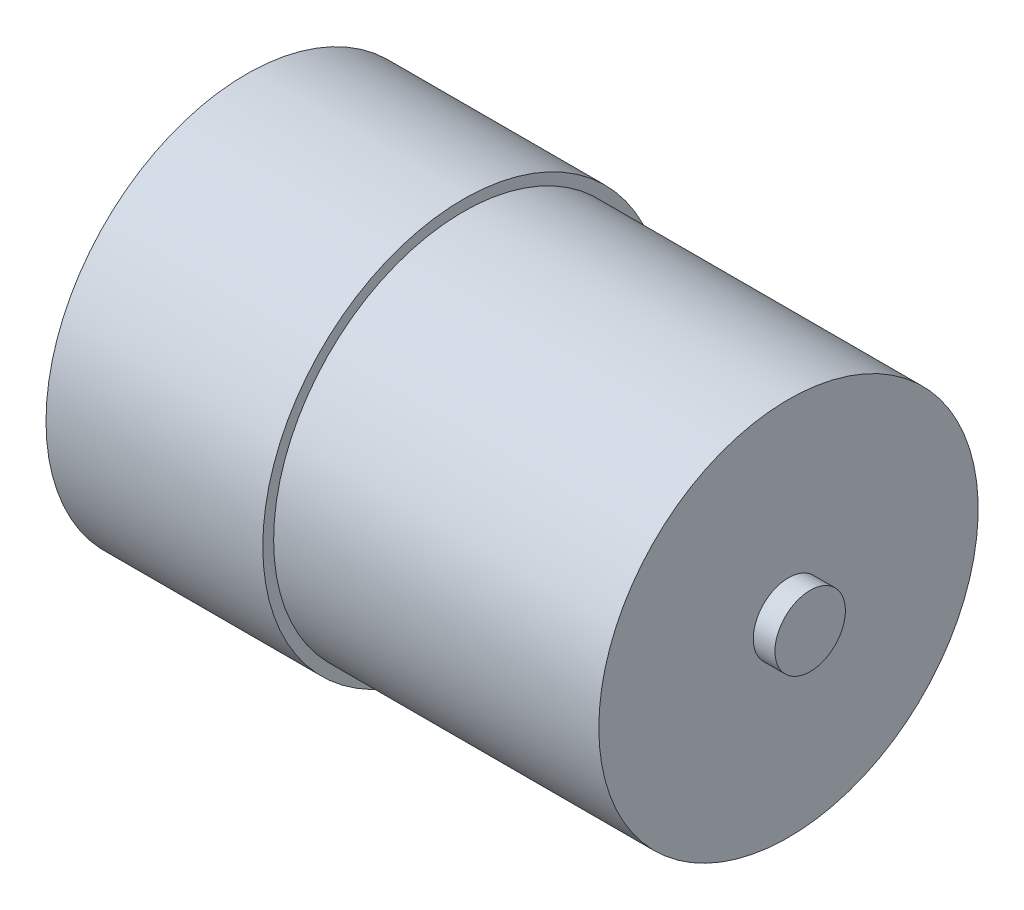
ISO-10303-21;
HEADER;
FILE_DESCRIPTION(('STEP AP214'),'2;1');
FILE_NAME('part.step','',(''),(''),'','','');
FILE_SCHEMA(('AUTOMOTIVE_DESIGN { 1 0 10303 214 1 1 1 1 }'));
ENDSEC;
DATA;
#1=APPLICATION_CONTEXT('core data for automotive mechanical design processes');
#2=APPLICATION_PROTOCOL_DEFINITION('international standard','automotive_design',2000,#1);
#3=PRODUCT_CONTEXT('',#1,'mechanical');
#4=PRODUCT('Part','Part','',(#3));
#5=PRODUCT_RELATED_PRODUCT_CATEGORY('part','',(#4));
#6=PRODUCT_DEFINITION_FORMATION('','',#4);
#7=PRODUCT_DEFINITION_CONTEXT('part definition',#1,'design');
#8=PRODUCT_DEFINITION('design','',#6,#7);
#9=PRODUCT_DEFINITION_SHAPE('','',#8);
#10=(LENGTH_UNIT() NAMED_UNIT(*) SI_UNIT(.MILLI.,.METRE.));
#11=(NAMED_UNIT(*) PLANE_ANGLE_UNIT() SI_UNIT($,.RADIAN.));
#12=(NAMED_UNIT(*) SI_UNIT($,.STERADIAN.) SOLID_ANGLE_UNIT());
#13=UNCERTAINTY_MEASURE_WITH_UNIT(LENGTH_MEASURE(1.E-05),#10,'distance_accuracy_value','');
#14=(GEOMETRIC_REPRESENTATION_CONTEXT(3) GLOBAL_UNCERTAINTY_ASSIGNED_CONTEXT((#13)) GLOBAL_UNIT_ASSIGNED_CONTEXT((#10,
#11,#12)) REPRESENTATION_CONTEXT('',''));
#15=CARTESIAN_POINT('',(0.,0.,0.));
#16=DIRECTION('',(0.,0.,1.));
#17=DIRECTION('',(1.,0.,0.));
#18=AXIS2_PLACEMENT_3D('',#15,#16,#17);
#19=CARTESIAN_POINT('',(30.,0.,0.));
#20=DIRECTION('',(1.,0.,0.));
#21=DIRECTION('',(0.,0.,-1.));
#22=AXIS2_PLACEMENT_3D('',#19,#20,#21);
#23=PLANE('',#22);
#24=CARTESIAN_POINT('',(30.,0.,0.));
#25=DIRECTION('',(-1.,0.,0.));
#26=DIRECTION('',(0.,0.,1.));
#27=AXIS2_PLACEMENT_3D('',#24,#25,#26);
#28=CIRCLE('',#27,3.25);
#29=CARTESIAN_POINT('',(30.,0.,3.25));
#30=VERTEX_POINT('',#29);
#31=EDGE_CURVE('E87',#30,#30,#28,.T.);
#32=ORIENTED_EDGE('',*,*,#31,.T.);
#33=EDGE_LOOP('',(#32));
#34=FACE_BOUND('',#33,.T.);
#35=CARTESIAN_POINT('',(30.,0.,0.));
#36=DIRECTION('',(-1.,0.,0.));
#37=DIRECTION('',(0.,0.,1.));
#38=AXIS2_PLACEMENT_3D('',#35,#36,#37);
#39=CIRCLE('',#38,17.5);
#40=CARTESIAN_POINT('',(30.,0.,17.5));
#41=VERTEX_POINT('',#40);
#42=EDGE_CURVE('E72',#41,#41,#39,.T.);
#43=ORIENTED_EDGE('',*,*,#42,.F.);
#44=EDGE_LOOP('',(#43));
#45=FACE_BOUND('',#44,.T.);
#46=ADVANCED_FACE('F43',(#34,#45),#23,.T.);
#47=CARTESIAN_POINT('',(-72.0349695755369,0.,0.));
#48=DIRECTION('',(-1.,0.,0.));
#49=DIRECTION('',(0.,0.,1.));
#50=AXIS2_PLACEMENT_3D('',#47,#48,#49);
#51=CYLINDRICAL_SURFACE('',#50,17.5);
#52=ORIENTED_EDGE('',*,*,#42,.T.);
#53=EDGE_LOOP('',(#52));
#54=FACE_BOUND('',#53,.T.);
#55=CARTESIAN_POINT('',(0.,0.,0.));
#56=DIRECTION('',(-1.,0.,0.));
#57=DIRECTION('',(0.,0.,1.));
#58=AXIS2_PLACEMENT_3D('',#55,#56,#57);
#59=CIRCLE('',#58,17.5);
#60=CARTESIAN_POINT('',(0.,0.,17.5));
#61=VERTEX_POINT('',#60);
#62=EDGE_CURVE('E105',#61,#61,#59,.T.);
#63=ORIENTED_EDGE('',*,*,#62,.F.);
#64=EDGE_LOOP('',(#63));
#65=FACE_BOUND('',#64,.T.);
#66=ADVANCED_FACE('F111',(#54,#65),#51,.T.);
#67=CARTESIAN_POINT('',(0.,0.,0.));
#68=DIRECTION('',(1.,0.,0.));
#69=DIRECTION('',(0.,0.,-1.));
#70=AXIS2_PLACEMENT_3D('',#67,#68,#69);
#71=PLANE('',#70);
#72=ORIENTED_EDGE('',*,*,#62,.T.);
#73=EDGE_LOOP('',(#72));
#74=FACE_BOUND('',#73,.T.);
#75=CARTESIAN_POINT('',(0.,0.,0.));
#76=DIRECTION('',(-1.,0.,0.));
#77=DIRECTION('',(0.,0.,1.));
#78=AXIS2_PLACEMENT_3D('',#75,#76,#77);
#79=CIRCLE('',#78,18.5);
#80=CARTESIAN_POINT('',(0.,0.,18.5));
#81=VERTEX_POINT('',#80);
#82=EDGE_CURVE('E102',#81,#81,#79,.T.);
#83=ORIENTED_EDGE('',*,*,#82,.F.);
#84=EDGE_LOOP('',(#83));
#85=FACE_BOUND('',#84,.T.);
#86=ADVANCED_FACE('F119',(#74,#85),#71,.T.);
#87=CARTESIAN_POINT('',(-72.0349695755369,0.,0.));
#88=DIRECTION('',(-1.,0.,0.));
#89=DIRECTION('',(0.,0.,1.));
#90=AXIS2_PLACEMENT_3D('',#87,#88,#89);
#91=CYLINDRICAL_SURFACE('',#90,18.5);
#92=ORIENTED_EDGE('',*,*,#82,.T.);
#93=EDGE_LOOP('',(#92));
#94=FACE_BOUND('',#93,.T.);
#95=CARTESIAN_POINT('',(-20.,0.,0.));
#96=DIRECTION('',(-1.,0.,0.));
#97=DIRECTION('',(0.,0.,1.));
#98=AXIS2_PLACEMENT_3D('',#95,#96,#97);
#99=CIRCLE('',#98,18.5);
#100=CARTESIAN_POINT('',(-20.,0.,18.5));
#101=VERTEX_POINT('',#100);
#102=EDGE_CURVE('E99',#101,#101,#99,.T.);
#103=ORIENTED_EDGE('',*,*,#102,.F.);
#104=EDGE_LOOP('',(#103));
#105=FACE_BOUND('',#104,.T.);
#106=ADVANCED_FACE('F244',(#94,#105),#91,.T.);
#107=CARTESIAN_POINT('',(-20.,0.,0.));
#108=DIRECTION('',(-1.,0.,0.));
#109=DIRECTION('',(0.,0.,1.));
#110=AXIS2_PLACEMENT_3D('',#107,#108,#109);
#111=PLANE('',#110);
#112=CARTESIAN_POINT('',(-20.,0.,15.5));
#113=DIRECTION('',(-1.,0.,0.));
#114=DIRECTION('',(0.,0.,1.));
#115=AXIS2_PLACEMENT_3D('',#112,#113,#114);
#116=CIRCLE('',#115,1.5);
#117=CARTESIAN_POINT('',(-20.,0.,17.));
#118=VERTEX_POINT('',#117);
#119=EDGE_CURVE('E125',#118,#118,#116,.T.);
#120=ORIENTED_EDGE('',*,*,#119,.F.);
#121=EDGE_LOOP('',(#120));
#122=FACE_BOUND('',#121,.T.);
#123=CARTESIAN_POINT('',(-20.,13.4233937586587,7.75000000000016));
#124=DIRECTION('',(-1.,0.,0.));
#125=DIRECTION('',(0.,0.,1.));
#126=AXIS2_PLACEMENT_3D('',#123,#124,#125);
#127=CIRCLE('',#126,1.5);
#128=CARTESIAN_POINT('',(-20.,13.4233937586587,9.25000000000016));
#129=VERTEX_POINT('',#128);
#130=EDGE_CURVE('E77',#129,#129,#127,.T.);
#131=ORIENTED_EDGE('',*,*,#130,.F.);
#132=EDGE_LOOP('',(#131));
#133=FACE_BOUND('',#132,.T.);
#134=CARTESIAN_POINT('',(-20.,13.4233937586589,-7.74999999999987));
#135=DIRECTION('',(-1.,0.,0.));
#136=DIRECTION('',(0.,0.,1.));
#137=AXIS2_PLACEMENT_3D('',#134,#135,#136);
#138=CIRCLE('',#137,1.5);
#139=CARTESIAN_POINT('',(-20.,13.4233937586589,-6.24999999999987));
#140=VERTEX_POINT('',#139);
#141=EDGE_CURVE('E128',#140,#140,#138,.T.);
#142=ORIENTED_EDGE('',*,*,#141,.F.);
#143=EDGE_LOOP('',(#142));
#144=FACE_BOUND('',#143,.T.);
#145=CARTESIAN_POINT('',(-20.,1.08235921504137E-13,-15.5));
#146=DIRECTION('',(-1.,0.,0.));
#147=DIRECTION('',(0.,0.,1.));
#148=AXIS2_PLACEMENT_3D('',#145,#146,#147);
#149=CIRCLE('',#148,1.5);
#150=CARTESIAN_POINT('',(-20.,1.08235921504137E-13,-14.));
#151=VERTEX_POINT('',#150);
#152=EDGE_CURVE('E135',#151,#151,#149,.T.);
#153=ORIENTED_EDGE('',*,*,#152,.F.);
#154=EDGE_LOOP('',(#153));
#155=FACE_BOUND('',#154,.T.);
#156=CARTESIAN_POINT('',(-20.,-13.4233937586588,-7.75000000000006));
#157=DIRECTION('',(-1.,0.,0.));
#158=DIRECTION('',(0.,0.,1.));
#159=AXIS2_PLACEMENT_3D('',#156,#157,#158);
#160=CIRCLE('',#159,1.5);
#161=CARTESIAN_POINT('',(-20.,-13.4233937586588,-6.25000000000006));
#162=VERTEX_POINT('',#161);
#163=EDGE_CURVE('E141',#162,#162,#160,.T.);
#164=ORIENTED_EDGE('',*,*,#163,.F.);
#165=EDGE_LOOP('',(#164));
#166=FACE_BOUND('',#165,.T.);
#167=CARTESIAN_POINT('',(-20.,-13.4233937586588,7.74999999999997));
#168=DIRECTION('',(-1.,0.,0.));
#169=DIRECTION('',(0.,0.,1.));
#170=AXIS2_PLACEMENT_3D('',#167,#168,#169);
#171=CIRCLE('',#170,1.5);
#172=CARTESIAN_POINT('',(-20.,-13.4233937586588,9.24999999999997));
#173=VERTEX_POINT('',#172);
#174=EDGE_CURVE('E147',#173,#173,#171,.T.);
#175=ORIENTED_EDGE('',*,*,#174,.F.);
#176=EDGE_LOOP('',(#175));
#177=FACE_BOUND('',#176,.T.);
#178=ORIENTED_EDGE('',*,*,#102,.T.);
#179=EDGE_LOOP('',(#178));
#180=FACE_BOUND('',#179,.T.);
#181=CARTESIAN_POINT('',(-20.,0.,0.));
#182=DIRECTION('',(-1.,0.,0.));
#183=DIRECTION('',(0.,0.,1.));
#184=AXIS2_PLACEMENT_3D('',#181,#182,#183);
#185=CIRCLE('',#184,3.5);
#186=CARTESIAN_POINT('',(-20.,0.,3.5));
#187=VERTEX_POINT('',#186);
#188=EDGE_CURVE('E96',#187,#187,#185,.T.);
#189=ORIENTED_EDGE('',*,*,#188,.F.);
#190=EDGE_LOOP('',(#189));
#191=FACE_BOUND('',#190,.T.);
#192=ADVANCED_FACE('F240',(#122,#133,#144,#155,#166,#177,#180,#191),#111,.T.);
#193=CARTESIAN_POINT('',(-72.0349695755369,0.,0.));
#194=DIRECTION('',(-1.,0.,0.));
#195=DIRECTION('',(0.,0.,1.));
#196=AXIS2_PLACEMENT_3D('',#193,#194,#195);
#197=CYLINDRICAL_SURFACE('',#196,3.5);
#198=ORIENTED_EDGE('',*,*,#188,.T.);
#199=EDGE_LOOP('',(#198));
#200=FACE_BOUND('',#199,.T.);
#201=CARTESIAN_POINT('',(-22.5,0.,0.));
#202=DIRECTION('',(-1.,0.,0.));
#203=DIRECTION('',(0.,0.,1.));
#204=AXIS2_PLACEMENT_3D('',#201,#202,#203);
#205=CIRCLE('',#204,3.5);
#206=CARTESIAN_POINT('',(-22.5,0.,3.5));
#207=VERTEX_POINT('',#206);
#208=EDGE_CURVE('E93',#207,#207,#205,.T.);
#209=ORIENTED_EDGE('',*,*,#208,.F.);
#210=EDGE_LOOP('',(#209));
#211=FACE_BOUND('',#210,.T.);
#212=ADVANCED_FACE('F236',(#200,#211),#197,.T.);
#213=CARTESIAN_POINT('',(-22.5,0.,0.));
#214=DIRECTION('',(-1.,0.,0.));
#215=DIRECTION('',(0.,0.,1.));
#216=AXIS2_PLACEMENT_3D('',#213,#214,#215);
#217=PLANE('',#216);
#218=ORIENTED_EDGE('',*,*,#208,.T.);
#219=EDGE_LOOP('',(#218));
#220=FACE_BOUND('',#219,.T.);
#221=CARTESIAN_POINT('',(-22.5,0.,0.));
#222=DIRECTION('',(-1.,0.,0.));
#223=DIRECTION('',(0.,0.,1.));
#224=AXIS2_PLACEMENT_3D('',#221,#222,#223);
#225=CIRCLE('',#224,2.16814596487607);
#226=CARTESIAN_POINT('',(-22.5,0.,2.16814596487607));
#227=VERTEX_POINT('',#226);
#228=EDGE_CURVE('E84',#227,#227,#225,.T.);
#229=ORIENTED_EDGE('',*,*,#228,.F.);
#230=EDGE_LOOP('',(#229));
#231=FACE_BOUND('',#230,.T.);
#232=ADVANCED_FACE('F232',(#220,#231),#217,.T.);
#233=CARTESIAN_POINT('',(-22.4416649153367,0.,0.));
#234=DIRECTION('',(-1.,0.,0.));
#235=DIRECTION('',(0.,0.,1.));
#236=AXIS2_PLACEMENT_3D('',#233,#234,#235);
#237=CONICAL_SURFACE('',#236,2.,1.23685799911754);
#238=ORIENTED_EDGE('',*,*,#228,.T.);
#239=EDGE_LOOP('',(#238));
#240=FACE_BOUND('',#239,.T.);
#241=CARTESIAN_POINT('',(-22.4416649153367,0.,0.));
#242=DIRECTION('',(-1.,0.,0.));
#243=DIRECTION('',(0.,0.,1.));
#244=AXIS2_PLACEMENT_3D('',#241,#242,#243);
#245=CIRCLE('',#244,2.);
#246=CARTESIAN_POINT('',(-22.4416649153367,0.,2.));
#247=VERTEX_POINT('',#246);
#248=EDGE_CURVE('E80',#247,#247,#245,.T.);
#249=ORIENTED_EDGE('',*,*,#248,.F.);
#250=EDGE_LOOP('',(#249));
#251=FACE_BOUND('',#250,.T.);
#252=ADVANCED_FACE('F229',(#240,#251),#237,.F.);
#253=CARTESIAN_POINT('',(-72.0349695755369,0.,0.));
#254=DIRECTION('',(-1.,0.,0.));
#255=DIRECTION('',(0.,0.,1.));
#256=AXIS2_PLACEMENT_3D('',#253,#254,#255);
#257=CYLINDRICAL_SURFACE('',#256,2.);
#258=DIRECTION('',(-1.,0.,0.));
#259=VECTOR('',#258,1.);
#260=CARTESIAN_POINT('',(-72.0349695755369,1.5,1.3228756555323));
#261=LINE('',#260,#259);
#262=CARTESIAN_POINT('',(-31.4416649153367,1.5,1.3228756555323));
#263=VERTEX_POINT('',#262);
#264=CARTESIAN_POINT('',(-23.4416649153367,1.5,1.3228756555323));
#265=VERTEX_POINT('',#264);
#266=EDGE_CURVE('E62',#263,#265,#261,.F.);
#267=ORIENTED_EDGE('',*,*,#266,.F.);
#268=CARTESIAN_POINT('',(-31.4416649153367,0.,0.));
#269=DIRECTION('',(-1.,0.,0.));
#270=DIRECTION('',(0.,0.,1.));
#271=AXIS2_PLACEMENT_3D('',#268,#269,#270);
#272=CIRCLE('',#271,2.);
#273=CARTESIAN_POINT('',(-31.4416649153367,1.5,-1.3228756555323));
#274=VERTEX_POINT('',#273);
#275=EDGE_CURVE('E76',#274,#263,#272,.T.);
#276=ORIENTED_EDGE('',*,*,#275,.F.);
#277=DIRECTION('',(-1.,0.,0.));
#278=VECTOR('',#277,1.);
#279=CARTESIAN_POINT('',(-72.0349695755369,1.5,-1.3228756555323));
#280=LINE('',#279,#278);
#281=CARTESIAN_POINT('',(-23.4416649153367,1.5,-1.3228756555323));
#282=VERTEX_POINT('',#281);
#283=EDGE_CURVE('E57',#282,#274,#280,.T.);
#284=ORIENTED_EDGE('',*,*,#283,.F.);
#285=CARTESIAN_POINT('',(-23.4416649153367,0.,0.));
#286=DIRECTION('',(-1.,0.,0.));
#287=DIRECTION('',(0.,0.,1.));
#288=AXIS2_PLACEMENT_3D('',#285,#286,#287);
#289=CIRCLE('',#288,2.);
#290=EDGE_CURVE('E11',#282,#265,#289,.F.);
#291=ORIENTED_EDGE('',*,*,#290,.T.);
#292=EDGE_LOOP('',(#267,#276,#284,#291));
#293=FACE_BOUND('',#292,.T.);
#294=ORIENTED_EDGE('',*,*,#248,.T.);
#295=EDGE_LOOP('',(#294));
#296=FACE_BOUND('',#295,.T.);
#297=ADVANCED_FACE('F74',(#293,#296),#257,.T.);
#298=CARTESIAN_POINT('',(-31.4416649153367,0.,0.));
#299=DIRECTION('',(-1.,0.,0.));
#300=DIRECTION('',(0.,0.,1.));
#301=AXIS2_PLACEMENT_3D('',#298,#299,#300);
#302=PLANE('',#301);
#303=DIRECTION('',(0.,0.,1.));
#304=VECTOR('',#303,1.);
#305=CARTESIAN_POINT('',(-31.4416649153367,1.5,0.));
#306=LINE('',#305,#304);
#307=EDGE_CURVE('E50',#274,#263,#306,.T.);
#308=ORIENTED_EDGE('',*,*,#307,.F.);
#309=ORIENTED_EDGE('',*,*,#275,.T.);
#310=EDGE_LOOP('',(#308,#309));
#311=FACE_BOUND('',#310,.T.);
#312=ADVANCED_FACE('F79',(#311),#302,.T.);
#313=CARTESIAN_POINT('',(32.,0.,0.));
#314=DIRECTION('',(-1.,0.,0.));
#315=DIRECTION('',(0.,0.,1.));
#316=AXIS2_PLACEMENT_3D('',#313,#314,#315);
#317=PLANE('',#316);
#318=CARTESIAN_POINT('',(32.,0.,0.));
#319=DIRECTION('',(-1.,0.,0.));
#320=DIRECTION('',(0.,0.,1.));
#321=AXIS2_PLACEMENT_3D('',#318,#319,#320);
#322=CIRCLE('',#321,3.25);
#323=CARTESIAN_POINT('',(32.,0.,3.25));
#324=VERTEX_POINT('',#323);
#325=EDGE_CURVE('E81',#324,#324,#322,.T.);
#326=ORIENTED_EDGE('',*,*,#325,.F.);
#327=EDGE_LOOP('',(#326));
#328=FACE_BOUND('',#327,.T.);
#329=ADVANCED_FACE('F221',(#328),#317,.F.);
#330=CARTESIAN_POINT('',(-72.0349695755369,0.,0.));
#331=DIRECTION('',(-1.,0.,0.));
#332=DIRECTION('',(0.,0.,1.));
#333=AXIS2_PLACEMENT_3D('',#330,#331,#332);
#334=CYLINDRICAL_SURFACE('',#333,3.25);
#335=ORIENTED_EDGE('',*,*,#31,.F.);
#336=EDGE_LOOP('',(#335));
#337=FACE_BOUND('',#336,.T.);
#338=ORIENTED_EDGE('',*,*,#325,.T.);
#339=EDGE_LOOP('',(#338));
#340=FACE_BOUND('',#339,.T.);
#341=ADVANCED_FACE('F195',(#337,#340),#334,.T.);
#342=CARTESIAN_POINT('',(-15.,-13.4233937586588,7.74999999999997));
#343=DIRECTION('',(-1.,0.,0.));
#344=DIRECTION('',(0.,0.,1.));
#345=AXIS2_PLACEMENT_3D('',#342,#343,#344);
#346=CYLINDRICAL_SURFACE('',#345,1.5);
#347=CARTESIAN_POINT('',(-15.,-13.4233937586588,7.74999999999997));
#348=DIRECTION('',(-1.,0.,0.));
#349=DIRECTION('',(0.,0.,1.));
#350=AXIS2_PLACEMENT_3D('',#347,#348,#349);
#351=CIRCLE('',#350,1.5);
#352=CARTESIAN_POINT('',(-15.,-13.4233937586588,9.24999999999997));
#353=VERTEX_POINT('',#352);
#354=EDGE_CURVE('E150',#353,#353,#351,.T.);
#355=ORIENTED_EDGE('',*,*,#354,.F.);
#356=EDGE_LOOP('',(#355));
#357=FACE_BOUND('',#356,.T.);
#358=ORIENTED_EDGE('',*,*,#174,.T.);
#359=EDGE_LOOP('',(#358));
#360=FACE_BOUND('',#359,.T.);
#361=ADVANCED_FACE('F191',(#357,#360),#346,.F.);
#362=CARTESIAN_POINT('',(-15.,-13.4233937586588,7.74999999999997));
#363=DIRECTION('',(-1.,0.,0.));
#364=DIRECTION('',(0.,0.,1.));
#365=AXIS2_PLACEMENT_3D('',#362,#363,#364);
#366=PLANE('',#365);
#367=ORIENTED_EDGE('',*,*,#354,.T.);
#368=EDGE_LOOP('',(#367));
#369=FACE_BOUND('',#368,.T.);
#370=ADVANCED_FACE('F187',(#369),#366,.T.);
#371=CARTESIAN_POINT('',(-15.,-13.4233937586588,-7.75000000000006));
#372=DIRECTION('',(-1.,0.,0.));
#373=DIRECTION('',(0.,0.,1.));
#374=AXIS2_PLACEMENT_3D('',#371,#372,#373);
#375=CYLINDRICAL_SURFACE('',#374,1.5);
#376=CARTESIAN_POINT('',(-15.,-13.4233937586588,-7.75000000000006));
#377=DIRECTION('',(-1.,0.,0.));
#378=DIRECTION('',(0.,0.,1.));
#379=AXIS2_PLACEMENT_3D('',#376,#377,#378);
#380=CIRCLE('',#379,1.5);
#381=CARTESIAN_POINT('',(-15.,-13.4233937586588,-6.25000000000006));
#382=VERTEX_POINT('',#381);
#383=EDGE_CURVE('E144',#382,#382,#380,.T.);
#384=ORIENTED_EDGE('',*,*,#383,.F.);
#385=EDGE_LOOP('',(#384));
#386=FACE_BOUND('',#385,.T.);
#387=ORIENTED_EDGE('',*,*,#163,.T.);
#388=EDGE_LOOP('',(#387));
#389=FACE_BOUND('',#388,.T.);
#390=ADVANCED_FACE('F190',(#386,#389),#375,.F.);
#391=CARTESIAN_POINT('',(-15.,-13.4233937586588,-7.75000000000006));
#392=DIRECTION('',(-1.,0.,0.));
#393=DIRECTION('',(0.,0.,1.));
#394=AXIS2_PLACEMENT_3D('',#391,#392,#393);
#395=PLANE('',#394);
#396=ORIENTED_EDGE('',*,*,#383,.T.);
#397=EDGE_LOOP('',(#396));
#398=FACE_BOUND('',#397,.T.);
#399=ADVANCED_FACE('F197',(#398),#395,.T.);
#400=CARTESIAN_POINT('',(-15.,1.08235921504137E-13,-15.5));
#401=DIRECTION('',(-1.,0.,0.));
#402=DIRECTION('',(0.,0.,1.));
#403=AXIS2_PLACEMENT_3D('',#400,#401,#402);
#404=CYLINDRICAL_SURFACE('',#403,1.5);
#405=CARTESIAN_POINT('',(-15.,1.08235921504137E-13,-15.5));
#406=DIRECTION('',(-1.,0.,0.));
#407=DIRECTION('',(0.,0.,1.));
#408=AXIS2_PLACEMENT_3D('',#405,#406,#407);
#409=CIRCLE('',#408,1.5);
#410=CARTESIAN_POINT('',(-15.,1.08235921504137E-13,-14.));
#411=VERTEX_POINT('',#410);
#412=EDGE_CURVE('E138',#411,#411,#409,.T.);
#413=ORIENTED_EDGE('',*,*,#412,.F.);
#414=EDGE_LOOP('',(#413));
#415=FACE_BOUND('',#414,.T.);
#416=ORIENTED_EDGE('',*,*,#152,.T.);
#417=EDGE_LOOP('',(#416));
#418=FACE_BOUND('',#417,.T.);
#419=ADVANCED_FACE('F200',(#415,#418),#404,.F.);
#420=CARTESIAN_POINT('',(-15.,1.08235921504137E-13,-15.5));
#421=DIRECTION('',(-1.,0.,0.));
#422=DIRECTION('',(0.,0.,1.));
#423=AXIS2_PLACEMENT_3D('',#420,#421,#422);
#424=PLANE('',#423);
#425=ORIENTED_EDGE('',*,*,#412,.T.);
#426=EDGE_LOOP('',(#425));
#427=FACE_BOUND('',#426,.T.);
#428=ADVANCED_FACE('F205',(#427),#424,.T.);
#429=CARTESIAN_POINT('',(-15.,13.4233937586589,-7.74999999999987));
#430=DIRECTION('',(-1.,0.,0.));
#431=DIRECTION('',(0.,0.,1.));
#432=AXIS2_PLACEMENT_3D('',#429,#430,#431);
#433=CYLINDRICAL_SURFACE('',#432,1.5);
#434=CARTESIAN_POINT('',(-15.,13.4233937586589,-7.74999999999987));
#435=DIRECTION('',(-1.,0.,0.));
#436=DIRECTION('',(0.,0.,1.));
#437=AXIS2_PLACEMENT_3D('',#434,#435,#436);
#438=CIRCLE('',#437,1.5);
#439=CARTESIAN_POINT('',(-15.,13.4233937586589,-6.24999999999987));
#440=VERTEX_POINT('',#439);
#441=EDGE_CURVE('E131',#440,#440,#438,.T.);
#442=ORIENTED_EDGE('',*,*,#441,.F.);
#443=EDGE_LOOP('',(#442));
#444=FACE_BOUND('',#443,.T.);
#445=ORIENTED_EDGE('',*,*,#141,.T.);
#446=EDGE_LOOP('',(#445));
#447=FACE_BOUND('',#446,.T.);
#448=ADVANCED_FACE('F208',(#444,#447),#433,.F.);
#449=CARTESIAN_POINT('',(-15.,13.4233937586589,-7.74999999999987));
#450=DIRECTION('',(-1.,0.,0.));
#451=DIRECTION('',(0.,0.,1.));
#452=AXIS2_PLACEMENT_3D('',#449,#450,#451);
#453=PLANE('',#452);
#454=ORIENTED_EDGE('',*,*,#441,.T.);
#455=EDGE_LOOP('',(#454));
#456=FACE_BOUND('',#455,.T.);
#457=ADVANCED_FACE('F185',(#456),#453,.T.);
#458=CARTESIAN_POINT('',(-15.,13.4233937586587,7.75000000000016));
#459=DIRECTION('',(-1.,0.,0.));
#460=DIRECTION('',(0.,0.,1.));
#461=AXIS2_PLACEMENT_3D('',#458,#459,#460);
#462=CYLINDRICAL_SURFACE('',#461,1.5);
#463=CARTESIAN_POINT('',(-15.,13.4233937586587,7.75000000000016));
#464=DIRECTION('',(-1.,0.,0.));
#465=DIRECTION('',(0.,0.,1.));
#466=AXIS2_PLACEMENT_3D('',#463,#464,#465);
#467=CIRCLE('',#466,1.5);
#468=CARTESIAN_POINT('',(-15.,13.4233937586587,9.25000000000016));
#469=VERTEX_POINT('',#468);
#470=EDGE_CURVE('E132',#469,#469,#467,.T.);
#471=ORIENTED_EDGE('',*,*,#470,.F.);
#472=EDGE_LOOP('',(#471));
#473=FACE_BOUND('',#472,.T.);
#474=ORIENTED_EDGE('',*,*,#130,.T.);
#475=EDGE_LOOP('',(#474));
#476=FACE_BOUND('',#475,.T.);
#477=ADVANCED_FACE('F181',(#473,#476),#462,.F.);
#478=CARTESIAN_POINT('',(-15.,13.4233937586587,7.75000000000016));
#479=DIRECTION('',(-1.,0.,0.));
#480=DIRECTION('',(0.,0.,1.));
#481=AXIS2_PLACEMENT_3D('',#478,#479,#480);
#482=PLANE('',#481);
#483=ORIENTED_EDGE('',*,*,#470,.T.);
#484=EDGE_LOOP('',(#483));
#485=FACE_BOUND('',#484,.T.);
#486=ADVANCED_FACE('F177',(#485),#482,.T.);
#487=CARTESIAN_POINT('',(-15.,0.,15.5));
#488=DIRECTION('',(-1.,0.,0.));
#489=DIRECTION('',(0.,0.,1.));
#490=AXIS2_PLACEMENT_3D('',#487,#488,#489);
#491=CYLINDRICAL_SURFACE('',#490,1.5);
#492=CARTESIAN_POINT('',(-15.,0.,15.5));
#493=DIRECTION('',(-1.,0.,0.));
#494=DIRECTION('',(0.,0.,1.));
#495=AXIS2_PLACEMENT_3D('',#492,#493,#494);
#496=CIRCLE('',#495,1.5);
#497=CARTESIAN_POINT('',(-15.,0.,17.));
#498=VERTEX_POINT('',#497);
#499=EDGE_CURVE('E123',#498,#498,#496,.T.);
#500=ORIENTED_EDGE('',*,*,#499,.F.);
#501=EDGE_LOOP('',(#500));
#502=FACE_BOUND('',#501,.T.);
#503=ORIENTED_EDGE('',*,*,#119,.T.);
#504=EDGE_LOOP('',(#503));
#505=FACE_BOUND('',#504,.T.);
#506=ADVANCED_FACE('F173',(#502,#505),#491,.F.);
#507=CARTESIAN_POINT('',(-15.,0.,15.5));
#508=DIRECTION('',(-1.,0.,0.));
#509=DIRECTION('',(0.,0.,1.));
#510=AXIS2_PLACEMENT_3D('',#507,#508,#509);
#511=PLANE('',#510);
#512=ORIENTED_EDGE('',*,*,#499,.T.);
#513=EDGE_LOOP('',(#512));
#514=FACE_BOUND('',#513,.T.);
#515=ADVANCED_FACE('F168',(#514),#511,.T.);
#516=CARTESIAN_POINT('',(-23.4416649153367,1.5,-2.54969341153708));
#517=DIRECTION('',(0.,-1.,0.));
#518=DIRECTION('',(0.,0.,-1.));
#519=AXIS2_PLACEMENT_3D('',#516,#517,#518);
#520=PLANE('',#519);
#521=ORIENTED_EDGE('',*,*,#266,.T.);
#522=DIRECTION('',(0.,0.,1.));
#523=VECTOR('',#522,1.);
#524=CARTESIAN_POINT('',(-23.4416649153367,1.5,-2.54969341153708));
#525=LINE('',#524,#523);
#526=EDGE_CURVE('E160',#282,#265,#525,.T.);
#527=ORIENTED_EDGE('',*,*,#526,.F.);
#528=ORIENTED_EDGE('',*,*,#283,.T.);
#529=ORIENTED_EDGE('',*,*,#307,.T.);
#530=EDGE_LOOP('',(#521,#527,#528,#529));
#531=FACE_BOUND('',#530,.T.);
#532=ADVANCED_FACE('F68',(#531),#520,.F.);
#533=CARTESIAN_POINT('',(-23.4416649153367,0.,0.));
#534=DIRECTION('',(-1.,0.,0.));
#535=DIRECTION('',(0.,0.,1.));
#536=AXIS2_PLACEMENT_3D('',#533,#534,#535);
#537=PLANE('',#536);
#538=ORIENTED_EDGE('',*,*,#526,.T.);
#539=ORIENTED_EDGE('',*,*,#290,.F.);
#540=EDGE_LOOP('',(#538,#539));
#541=FACE_BOUND('',#540,.T.);
#542=ADVANCED_FACE('F162',(#541),#537,.T.);
#543=CLOSED_SHELL('',(#46,#66,#86,#106,#192,#212,#232,#252,#297,#312,#329,#341,#361,#370,#390,
#399,#419,#428,#448,#457,#477,#486,#506,#515,#532,#542));
#544=MANIFOLD_SOLID_BREP('B2',#543);
#545=ADVANCED_BREP_SHAPE_REPRESENTATION('',(#18,#544),#14);
#546=SHAPE_DEFINITION_REPRESENTATION(#9,#545);
ENDSEC;
END-ISO-10303-21;
